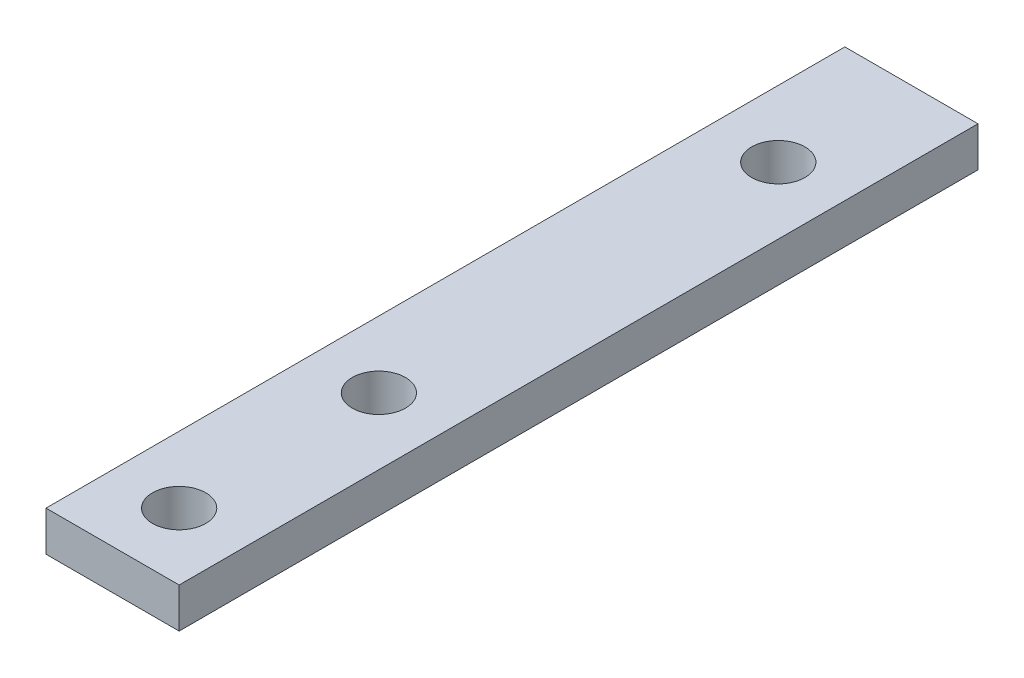
ISO-10303-21;
HEADER;
FILE_DESCRIPTION(('STEP AP214'),'2;1');
FILE_NAME('part.step','',(''),(''),'','','');
FILE_SCHEMA(('AUTOMOTIVE_DESIGN { 1 0 10303 214 1 1 1 1 }'));
ENDSEC;
DATA;
#1=APPLICATION_CONTEXT('core data for automotive mechanical design processes');
#2=APPLICATION_PROTOCOL_DEFINITION('international standard','automotive_design',2000,#1);
#3=PRODUCT_CONTEXT('',#1,'mechanical');
#4=PRODUCT('Part','Part','',(#3));
#5=PRODUCT_RELATED_PRODUCT_CATEGORY('part','',(#4));
#6=PRODUCT_DEFINITION_FORMATION('','',#4);
#7=PRODUCT_DEFINITION_CONTEXT('part definition',#1,'design');
#8=PRODUCT_DEFINITION('design','',#6,#7);
#9=PRODUCT_DEFINITION_SHAPE('','',#8);
#10=(LENGTH_UNIT() NAMED_UNIT(*) SI_UNIT(.MILLI.,.METRE.));
#11=(NAMED_UNIT(*) PLANE_ANGLE_UNIT() SI_UNIT($,.RADIAN.));
#12=(NAMED_UNIT(*) SI_UNIT($,.STERADIAN.) SOLID_ANGLE_UNIT());
#13=UNCERTAINTY_MEASURE_WITH_UNIT(LENGTH_MEASURE(1.E-05),#10,'distance_accuracy_value','');
#14=(GEOMETRIC_REPRESENTATION_CONTEXT(3) GLOBAL_UNCERTAINTY_ASSIGNED_CONTEXT((#13)) GLOBAL_UNIT_ASSIGNED_CONTEXT((#10,
#11,#12)) REPRESENTATION_CONTEXT('',''));
#15=CARTESIAN_POINT('',(0.,0.,0.));
#16=DIRECTION('',(0.,0.,1.));
#17=DIRECTION('',(1.,0.,0.));
#18=AXIS2_PLACEMENT_3D('',#15,#16,#17);
#19=CARTESIAN_POINT('',(0.,3.,0.));
#20=DIRECTION('',(0.,-1.,0.));
#21=DIRECTION('',(0.,0.,-1.));
#22=AXIS2_PLACEMENT_3D('',#19,#20,#21);
#23=PLANE('',#22);
#24=DIRECTION('',(1.,0.,0.));
#25=VECTOR('',#24,1.);
#26=CARTESIAN_POINT('',(5.,3.,0.));
#27=LINE('',#26,#25);
#28=CARTESIAN_POINT('',(-5.,3.,0.));
#29=VERTEX_POINT('',#28);
#30=CARTESIAN_POINT('',(5.,3.,0.));
#31=VERTEX_POINT('',#30);
#32=EDGE_CURVE('E50',#29,#31,#27,.T.);
#33=ORIENTED_EDGE('',*,*,#32,.T.);
#34=DIRECTION('',(0.,0.,-1.));
#35=VECTOR('',#34,1.);
#36=CARTESIAN_POINT('',(5.,3.,-60.));
#37=LINE('',#36,#35);
#38=CARTESIAN_POINT('',(5.,3.,-60.));
#39=VERTEX_POINT('',#38);
#40=EDGE_CURVE('E81',#31,#39,#37,.T.);
#41=ORIENTED_EDGE('',*,*,#40,.T.);
#42=DIRECTION('',(-1.,0.,0.));
#43=VECTOR('',#42,1.);
#44=CARTESIAN_POINT('',(-5.,3.,-60.));
#45=LINE('',#44,#43);
#46=CARTESIAN_POINT('',(-5.,3.,-60.));
#47=VERTEX_POINT('',#46);
#48=EDGE_CURVE('E85',#39,#47,#45,.T.);
#49=ORIENTED_EDGE('',*,*,#48,.T.);
#50=DIRECTION('',(0.,0.,1.));
#51=VECTOR('',#50,1.);
#52=CARTESIAN_POINT('',(-5.,3.,0.));
#53=LINE('',#52,#51);
#54=EDGE_CURVE('E92',#47,#29,#53,.T.);
#55=ORIENTED_EDGE('',*,*,#54,.T.);
#56=EDGE_LOOP('',(#33,#41,#49,#55));
#57=FACE_BOUND('',#56,.T.);
#58=CARTESIAN_POINT('',(0.,3.,-20.));
#59=DIRECTION('',(0.,1.,0.));
#60=DIRECTION('',(0.,0.,1.));
#61=AXIS2_PLACEMENT_3D('',#58,#59,#60);
#62=CIRCLE('',#61,2.);
#63=CARTESIAN_POINT('',(0.,3.,-18.));
#64=VERTEX_POINT('',#63);
#65=EDGE_CURVE('E99',#64,#64,#62,.T.);
#66=ORIENTED_EDGE('',*,*,#65,.F.);
#67=EDGE_LOOP('',(#66));
#68=FACE_BOUND('',#67,.T.);
#69=CARTESIAN_POINT('',(0.,3.,-5.));
#70=DIRECTION('',(0.,1.,0.));
#71=DIRECTION('',(0.,0.,1.));
#72=AXIS2_PLACEMENT_3D('',#69,#70,#71);
#73=CIRCLE('',#72,2.);
#74=CARTESIAN_POINT('',(0.,3.,-3.));
#75=VERTEX_POINT('',#74);
#76=EDGE_CURVE('E150',#75,#75,#73,.T.);
#77=ORIENTED_EDGE('',*,*,#76,.F.);
#78=EDGE_LOOP('',(#77));
#79=FACE_BOUND('',#78,.T.);
#80=CARTESIAN_POINT('',(0.,3.,-50.));
#81=DIRECTION('',(0.,1.,0.));
#82=DIRECTION('',(0.,0.,1.));
#83=AXIS2_PLACEMENT_3D('',#80,#81,#82);
#84=CIRCLE('',#83,2.);
#85=CARTESIAN_POINT('',(0.,3.,-48.));
#86=VERTEX_POINT('',#85);
#87=EDGE_CURVE('E141',#86,#86,#84,.T.);
#88=ORIENTED_EDGE('',*,*,#87,.F.);
#89=EDGE_LOOP('',(#88));
#90=FACE_BOUND('',#89,.T.);
#91=ADVANCED_FACE('F33',(#57,#68,#79,#90),#23,.F.);
#92=CARTESIAN_POINT('',(0.,0.,0.));
#93=DIRECTION('',(0.,-1.,0.));
#94=DIRECTION('',(0.,0.,-1.));
#95=AXIS2_PLACEMENT_3D('',#92,#93,#94);
#96=PLANE('',#95);
#97=CARTESIAN_POINT('',(0.,0.,-5.));
#98=DIRECTION('',(0.,1.,0.));
#99=DIRECTION('',(0.,0.,1.));
#100=AXIS2_PLACEMENT_3D('',#97,#98,#99);
#101=CIRCLE('',#100,2.);
#102=CARTESIAN_POINT('',(0.,0.,-3.));
#103=VERTEX_POINT('',#102);
#104=EDGE_CURVE('E147',#103,#103,#101,.T.);
#105=ORIENTED_EDGE('',*,*,#104,.T.);
#106=EDGE_LOOP('',(#105));
#107=FACE_BOUND('',#106,.T.);
#108=DIRECTION('',(0.,0.,-1.));
#109=VECTOR('',#108,1.);
#110=CARTESIAN_POINT('',(5.,0.,-60.));
#111=LINE('',#110,#109);
#112=CARTESIAN_POINT('',(5.,0.,0.));
#113=VERTEX_POINT('',#112);
#114=CARTESIAN_POINT('',(5.,0.,-60.));
#115=VERTEX_POINT('',#114);
#116=EDGE_CURVE('E88',#113,#115,#111,.T.);
#117=ORIENTED_EDGE('',*,*,#116,.F.);
#118=DIRECTION('',(1.,0.,0.));
#119=VECTOR('',#118,1.);
#120=CARTESIAN_POINT('',(0.,0.,0.));
#121=LINE('',#120,#119);
#122=CARTESIAN_POINT('',(-5.,0.,0.));
#123=VERTEX_POINT('',#122);
#124=EDGE_CURVE('E102',#123,#113,#121,.T.);
#125=ORIENTED_EDGE('',*,*,#124,.F.);
#126=DIRECTION('',(0.,0.,1.));
#127=VECTOR('',#126,1.);
#128=CARTESIAN_POINT('',(-5.,0.,0.));
#129=LINE('',#128,#127);
#130=CARTESIAN_POINT('',(-5.,0.,-60.));
#131=VERTEX_POINT('',#130);
#132=EDGE_CURVE('E75',#131,#123,#129,.T.);
#133=ORIENTED_EDGE('',*,*,#132,.F.);
#134=DIRECTION('',(-1.,0.,0.));
#135=VECTOR('',#134,1.);
#136=CARTESIAN_POINT('',(-5.,0.,-60.));
#137=LINE('',#136,#135);
#138=EDGE_CURVE('E68',#115,#131,#137,.T.);
#139=ORIENTED_EDGE('',*,*,#138,.F.);
#140=EDGE_LOOP('',(#117,#125,#133,#139));
#141=FACE_BOUND('',#140,.T.);
#142=CARTESIAN_POINT('',(0.,0.,-20.));
#143=DIRECTION('',(0.,1.,0.));
#144=DIRECTION('',(0.,0.,1.));
#145=AXIS2_PLACEMENT_3D('',#142,#143,#144);
#146=CIRCLE('',#145,2.);
#147=CARTESIAN_POINT('',(0.,0.,-18.));
#148=VERTEX_POINT('',#147);
#149=EDGE_CURVE('E153',#148,#148,#146,.T.);
#150=ORIENTED_EDGE('',*,*,#149,.T.);
#151=EDGE_LOOP('',(#150));
#152=FACE_BOUND('',#151,.T.);
#153=CARTESIAN_POINT('',(0.,0.,-50.));
#154=DIRECTION('',(0.,1.,0.));
#155=DIRECTION('',(0.,0.,1.));
#156=AXIS2_PLACEMENT_3D('',#153,#154,#155);
#157=CIRCLE('',#156,2.);
#158=CARTESIAN_POINT('',(0.,0.,-48.));
#159=VERTEX_POINT('',#158);
#160=EDGE_CURVE('E144',#159,#159,#157,.T.);
#161=ORIENTED_EDGE('',*,*,#160,.T.);
#162=EDGE_LOOP('',(#161));
#163=FACE_BOUND('',#162,.T.);
#164=ADVANCED_FACE('F108',(#107,#141,#152,#163),#96,.T.);
#165=CARTESIAN_POINT('',(5.,3.,-60.));
#166=DIRECTION('',(-1.,0.,0.));
#167=DIRECTION('',(0.,0.,1.));
#168=AXIS2_PLACEMENT_3D('',#165,#166,#167);
#169=PLANE('',#168);
#170=ORIENTED_EDGE('',*,*,#116,.T.);
#171=DIRECTION('',(0.,-1.,0.));
#172=VECTOR('',#171,1.);
#173=CARTESIAN_POINT('',(5.,3.,-60.));
#174=LINE('',#173,#172);
#175=EDGE_CURVE('E42',#39,#115,#174,.T.);
#176=ORIENTED_EDGE('',*,*,#175,.F.);
#177=ORIENTED_EDGE('',*,*,#40,.F.);
#178=DIRECTION('',(0.,-1.,0.));
#179=VECTOR('',#178,1.);
#180=CARTESIAN_POINT('',(5.,3.,0.));
#181=LINE('',#180,#179);
#182=EDGE_CURVE('E11',#31,#113,#181,.T.);
#183=ORIENTED_EDGE('',*,*,#182,.T.);
#184=EDGE_LOOP('',(#170,#176,#177,#183));
#185=FACE_BOUND('',#184,.T.);
#186=ADVANCED_FACE('F35',(#185),#169,.F.);
#187=CARTESIAN_POINT('',(-5.,3.,-60.));
#188=DIRECTION('',(0.,0.,1.));
#189=DIRECTION('',(1.,0.,0.));
#190=AXIS2_PLACEMENT_3D('',#187,#188,#189);
#191=PLANE('',#190);
#192=ORIENTED_EDGE('',*,*,#138,.T.);
#193=DIRECTION('',(0.,-1.,0.));
#194=VECTOR('',#193,1.);
#195=CARTESIAN_POINT('',(-5.,3.,-60.));
#196=LINE('',#195,#194);
#197=EDGE_CURVE('E89',#47,#131,#196,.T.);
#198=ORIENTED_EDGE('',*,*,#197,.F.);
#199=ORIENTED_EDGE('',*,*,#48,.F.);
#200=ORIENTED_EDGE('',*,*,#175,.T.);
#201=EDGE_LOOP('',(#192,#198,#199,#200));
#202=FACE_BOUND('',#201,.T.);
#203=ADVANCED_FACE('F90',(#202),#191,.F.);
#204=CARTESIAN_POINT('',(-5.,3.,0.));
#205=DIRECTION('',(1.,0.,0.));
#206=DIRECTION('',(0.,0.,-1.));
#207=AXIS2_PLACEMENT_3D('',#204,#205,#206);
#208=PLANE('',#207);
#209=ORIENTED_EDGE('',*,*,#132,.T.);
#210=DIRECTION('',(0.,-1.,0.));
#211=VECTOR('',#210,1.);
#212=CARTESIAN_POINT('',(-5.,3.,0.));
#213=LINE('',#212,#211);
#214=EDGE_CURVE('E94',#29,#123,#213,.T.);
#215=ORIENTED_EDGE('',*,*,#214,.F.);
#216=ORIENTED_EDGE('',*,*,#54,.F.);
#217=ORIENTED_EDGE('',*,*,#197,.T.);
#218=EDGE_LOOP('',(#209,#215,#216,#217));
#219=FACE_BOUND('',#218,.T.);
#220=ADVANCED_FACE('F105',(#219),#208,.F.);
#221=CARTESIAN_POINT('',(0.,3.,0.));
#222=DIRECTION('',(0.,0.,-1.));
#223=DIRECTION('',(-1.,0.,0.));
#224=AXIS2_PLACEMENT_3D('',#221,#222,#223);
#225=PLANE('',#224);
#226=ORIENTED_EDGE('',*,*,#124,.T.);
#227=ORIENTED_EDGE('',*,*,#182,.F.);
#228=ORIENTED_EDGE('',*,*,#32,.F.);
#229=ORIENTED_EDGE('',*,*,#214,.T.);
#230=EDGE_LOOP('',(#226,#227,#228,#229));
#231=FACE_BOUND('',#230,.T.);
#232=ADVANCED_FACE('F110',(#231),#225,.F.);
#233=CARTESIAN_POINT('',(0.,3.,-20.));
#234=DIRECTION('',(0.,-1.,0.));
#235=DIRECTION('',(0.,0.,-1.));
#236=AXIS2_PLACEMENT_3D('',#233,#234,#235);
#237=CYLINDRICAL_SURFACE('',#236,2.);
#238=ORIENTED_EDGE('',*,*,#65,.T.);
#239=EDGE_LOOP('',(#238));
#240=FACE_BOUND('',#239,.T.);
#241=ORIENTED_EDGE('',*,*,#149,.F.);
#242=EDGE_LOOP('',(#241));
#243=FACE_BOUND('',#242,.T.);
#244=ADVANCED_FACE('F112',(#240,#243),#237,.F.);
#245=CARTESIAN_POINT('',(0.,3.,-5.));
#246=DIRECTION('',(0.,-1.,0.));
#247=DIRECTION('',(0.,0.,-1.));
#248=AXIS2_PLACEMENT_3D('',#245,#246,#247);
#249=CYLINDRICAL_SURFACE('',#248,2.);
#250=ORIENTED_EDGE('',*,*,#76,.T.);
#251=EDGE_LOOP('',(#250));
#252=FACE_BOUND('',#251,.T.);
#253=ORIENTED_EDGE('',*,*,#104,.F.);
#254=EDGE_LOOP('',(#253));
#255=FACE_BOUND('',#254,.T.);
#256=ADVANCED_FACE('F118',(#252,#255),#249,.F.);
#257=CARTESIAN_POINT('',(0.,3.,-50.));
#258=DIRECTION('',(0.,-1.,0.));
#259=DIRECTION('',(0.,0.,-1.));
#260=AXIS2_PLACEMENT_3D('',#257,#258,#259);
#261=CYLINDRICAL_SURFACE('',#260,2.);
#262=ORIENTED_EDGE('',*,*,#87,.T.);
#263=EDGE_LOOP('',(#262));
#264=FACE_BOUND('',#263,.T.);
#265=ORIENTED_EDGE('',*,*,#160,.F.);
#266=EDGE_LOOP('',(#265));
#267=FACE_BOUND('',#266,.T.);
#268=ADVANCED_FACE('F132',(#264,#267),#261,.F.);
#269=CLOSED_SHELL('',(#91,#164,#186,#203,#220,#232,#244,#256,#268));
#270=MANIFOLD_SOLID_BREP('B2',#269);
#271=ADVANCED_BREP_SHAPE_REPRESENTATION('',(#18,#270),#14);
#272=SHAPE_DEFINITION_REPRESENTATION(#9,#271);
ENDSEC;
END-ISO-10303-21;
